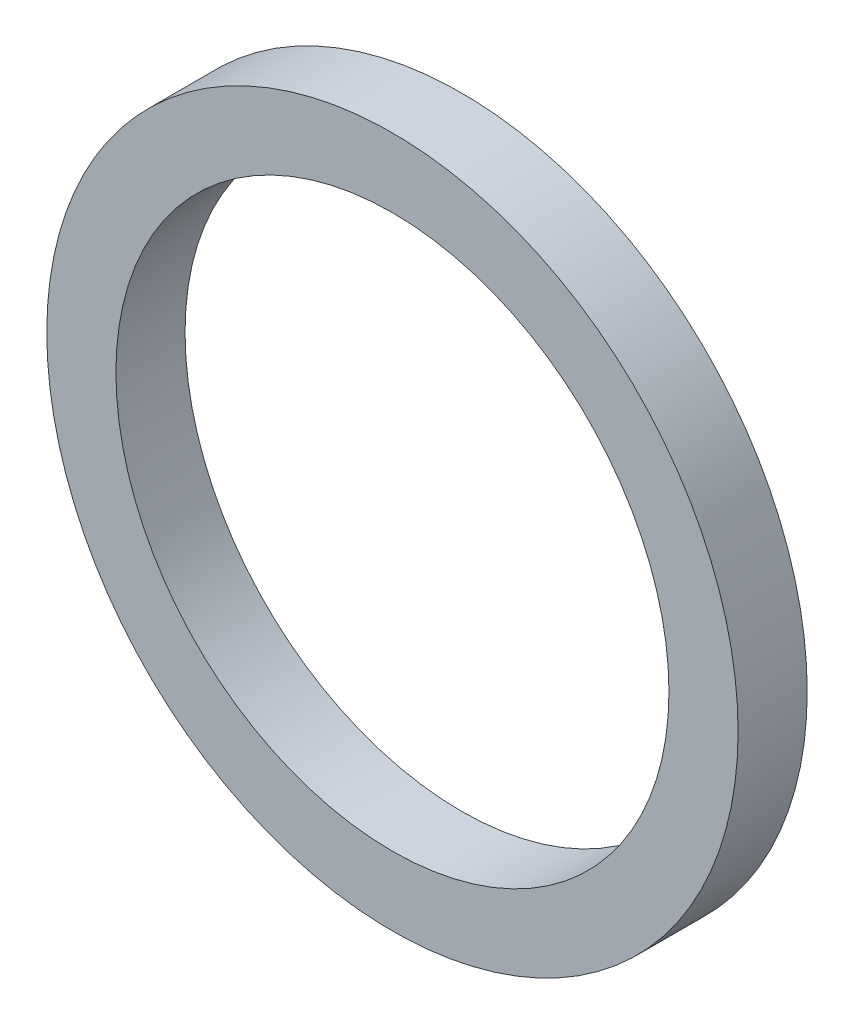
ISO-10303-21;
HEADER;
FILE_DESCRIPTION(('STEP AP214'),'2;1');
FILE_NAME('part.step','',(''),(''),'','','');
FILE_SCHEMA(('AUTOMOTIVE_DESIGN { 1 0 10303 214 1 1 1 1 }'));
ENDSEC;
DATA;
#1=APPLICATION_CONTEXT('core data for automotive mechanical design processes');
#2=APPLICATION_PROTOCOL_DEFINITION('international standard','automotive_design',2000,#1);
#3=PRODUCT_CONTEXT('',#1,'mechanical');
#4=PRODUCT('Part','Part','',(#3));
#5=PRODUCT_RELATED_PRODUCT_CATEGORY('part','',(#4));
#6=PRODUCT_DEFINITION_FORMATION('','',#4);
#7=PRODUCT_DEFINITION_CONTEXT('part definition',#1,'design');
#8=PRODUCT_DEFINITION('design','',#6,#7);
#9=PRODUCT_DEFINITION_SHAPE('','',#8);
#10=(LENGTH_UNIT() NAMED_UNIT(*) SI_UNIT(.MILLI.,.METRE.));
#11=(NAMED_UNIT(*) PLANE_ANGLE_UNIT() SI_UNIT($,.RADIAN.));
#12=(NAMED_UNIT(*) SI_UNIT($,.STERADIAN.) SOLID_ANGLE_UNIT());
#13=UNCERTAINTY_MEASURE_WITH_UNIT(LENGTH_MEASURE(1.E-05),#10,'distance_accuracy_value','');
#14=(GEOMETRIC_REPRESENTATION_CONTEXT(3) GLOBAL_UNCERTAINTY_ASSIGNED_CONTEXT((#13)) GLOBAL_UNIT_ASSIGNED_CONTEXT((#10,
#11,#12)) REPRESENTATION_CONTEXT('',''));
#15=CARTESIAN_POINT('',(0.,0.,0.));
#16=DIRECTION('',(0.,0.,1.));
#17=DIRECTION('',(1.,0.,0.));
#18=AXIS2_PLACEMENT_3D('',#15,#16,#17);
#19=CARTESIAN_POINT('',(0.,0.,1.5875));
#20=DIRECTION('',(0.,0.,1.));
#21=DIRECTION('',(1.,0.,0.));
#22=AXIS2_PLACEMENT_3D('',#19,#20,#21);
#23=PLANE('',#22);
#24=CARTESIAN_POINT('',(0.,0.,1.5875));
#25=DIRECTION('',(0.,0.,1.));
#26=DIRECTION('',(1.,0.,0.));
#27=AXIS2_PLACEMENT_3D('',#24,#25,#26);
#28=CIRCLE('',#27,7.9375);
#29=CARTESIAN_POINT('',(7.9375,0.,1.5875));
#30=VERTEX_POINT('',#29);
#31=EDGE_CURVE('E10',#30,#30,#28,.T.);
#32=ORIENTED_EDGE('',*,*,#31,.T.);
#33=EDGE_LOOP('',(#32));
#34=FACE_BOUND('',#33,.T.);
#35=CARTESIAN_POINT('',(0.,0.,1.5875));
#36=DIRECTION('',(0.,0.,1.));
#37=DIRECTION('',(1.,0.,0.));
#38=AXIS2_PLACEMENT_3D('',#35,#36,#37);
#39=CIRCLE('',#38,6.35);
#40=CARTESIAN_POINT('',(6.35,0.,1.5875));
#41=VERTEX_POINT('',#40);
#42=EDGE_CURVE('E43',#41,#41,#39,.T.);
#43=ORIENTED_EDGE('',*,*,#42,.F.);
#44=EDGE_LOOP('',(#43));
#45=FACE_BOUND('',#44,.T.);
#46=ADVANCED_FACE('F32',(#34,#45),#23,.T.);
#47=CARTESIAN_POINT('',(0.,0.,0.));
#48=DIRECTION('',(0.,0.,1.));
#49=DIRECTION('',(1.,0.,0.));
#50=AXIS2_PLACEMENT_3D('',#47,#48,#49);
#51=PLANE('',#50);
#52=CARTESIAN_POINT('',(0.,0.,0.));
#53=DIRECTION('',(0.,0.,1.));
#54=DIRECTION('',(1.,0.,0.));
#55=AXIS2_PLACEMENT_3D('',#52,#53,#54);
#56=CIRCLE('',#55,7.9375);
#57=CARTESIAN_POINT('',(7.9375,0.,0.));
#58=VERTEX_POINT('',#57);
#59=EDGE_CURVE('E36',#58,#58,#56,.T.);
#60=ORIENTED_EDGE('',*,*,#59,.F.);
#61=EDGE_LOOP('',(#60));
#62=FACE_BOUND('',#61,.T.);
#63=CARTESIAN_POINT('',(0.,0.,0.));
#64=DIRECTION('',(0.,0.,1.));
#65=DIRECTION('',(1.,0.,0.));
#66=AXIS2_PLACEMENT_3D('',#63,#64,#65);
#67=CIRCLE('',#66,6.35);
#68=CARTESIAN_POINT('',(6.35,0.,0.));
#69=VERTEX_POINT('',#68);
#70=EDGE_CURVE('E45',#69,#69,#67,.T.);
#71=ORIENTED_EDGE('',*,*,#70,.T.);
#72=EDGE_LOOP('',(#71));
#73=FACE_BOUND('',#72,.T.);
#74=ADVANCED_FACE('F55',(#62,#73),#51,.F.);
#75=CARTESIAN_POINT('',(0.,0.,1.5875));
#76=DIRECTION('',(0.,0.,-1.));
#77=DIRECTION('',(-1.,0.,0.));
#78=AXIS2_PLACEMENT_3D('',#75,#76,#77);
#79=CYLINDRICAL_SURFACE('',#78,7.9375);
#80=ORIENTED_EDGE('',*,*,#31,.F.);
#81=EDGE_LOOP('',(#80));
#82=FACE_BOUND('',#81,.T.);
#83=ORIENTED_EDGE('',*,*,#59,.T.);
#84=EDGE_LOOP('',(#83));
#85=FACE_BOUND('',#84,.T.);
#86=ADVANCED_FACE('F34',(#82,#85),#79,.T.);
#87=CARTESIAN_POINT('',(0.,0.,1.5875));
#88=DIRECTION('',(0.,0.,-1.));
#89=DIRECTION('',(-1.,0.,0.));
#90=AXIS2_PLACEMENT_3D('',#87,#88,#89);
#91=CYLINDRICAL_SURFACE('',#90,6.35);
#92=ORIENTED_EDGE('',*,*,#42,.T.);
#93=EDGE_LOOP('',(#92));
#94=FACE_BOUND('',#93,.T.);
#95=ORIENTED_EDGE('',*,*,#70,.F.);
#96=EDGE_LOOP('',(#95));
#97=FACE_BOUND('',#96,.T.);
#98=ADVANCED_FACE('F51',(#94,#97),#91,.F.);
#99=CLOSED_SHELL('',(#46,#74,#86,#98));
#100=MANIFOLD_SOLID_BREP('B2',#99);
#101=ADVANCED_BREP_SHAPE_REPRESENTATION('',(#18,#100),#14);
#102=SHAPE_DEFINITION_REPRESENTATION(#9,#101);
ENDSEC;
END-ISO-10303-21;
